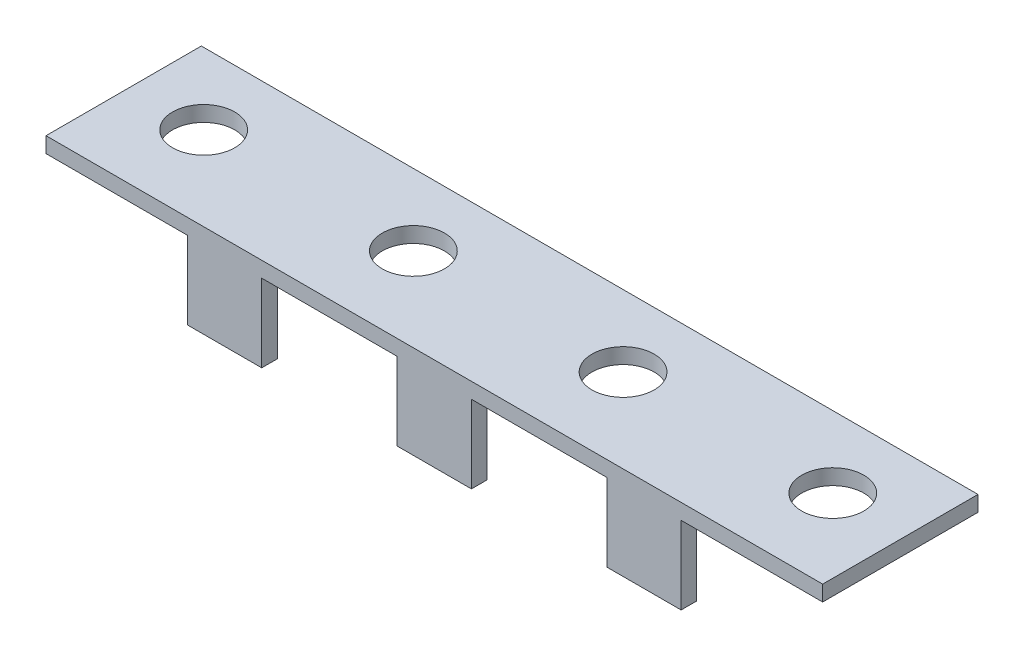
ISO-10303-21;
HEADER;
FILE_DESCRIPTION(('STEP AP214'),'2;1');
FILE_NAME('part.step','',(''),(''),'','','');
FILE_SCHEMA(('AUTOMOTIVE_DESIGN { 1 0 10303 214 1 1 1 1 }'));
ENDSEC;
DATA;
#1=APPLICATION_CONTEXT('core data for automotive mechanical design processes');
#2=APPLICATION_PROTOCOL_DEFINITION('international standard','automotive_design',2000,#1);
#3=PRODUCT_CONTEXT('',#1,'mechanical');
#4=PRODUCT('Part','Part','',(#3));
#5=PRODUCT_RELATED_PRODUCT_CATEGORY('part','',(#4));
#6=PRODUCT_DEFINITION_FORMATION('','',#4);
#7=PRODUCT_DEFINITION_CONTEXT('part definition',#1,'design');
#8=PRODUCT_DEFINITION('design','',#6,#7);
#9=PRODUCT_DEFINITION_SHAPE('','',#8);
#10=(LENGTH_UNIT() NAMED_UNIT(*) SI_UNIT(.MILLI.,.METRE.));
#11=(NAMED_UNIT(*) PLANE_ANGLE_UNIT() SI_UNIT($,.RADIAN.));
#12=(NAMED_UNIT(*) SI_UNIT($,.STERADIAN.) SOLID_ANGLE_UNIT());
#13=UNCERTAINTY_MEASURE_WITH_UNIT(LENGTH_MEASURE(1.E-05),#10,'distance_accuracy_value','');
#14=(GEOMETRIC_REPRESENTATION_CONTEXT(3) GLOBAL_UNCERTAINTY_ASSIGNED_CONTEXT((#13)) GLOBAL_UNIT_ASSIGNED_CONTEXT((#10,
#11,#12)) REPRESENTATION_CONTEXT('',''));
#15=CARTESIAN_POINT('',(0.,0.,0.));
#16=DIRECTION('',(0.,0.,1.));
#17=DIRECTION('',(1.,0.,0.));
#18=AXIS2_PLACEMENT_3D('',#15,#16,#17);
#19=CARTESIAN_POINT('',(0.,-12.7,-2.54));
#20=DIRECTION('',(0.,0.,1.));
#21=DIRECTION('',(1.,0.,0.));
#22=AXIS2_PLACEMENT_3D('',#19,#20,#21);
#23=PLANE('',#22);
#24=DIRECTION('',(1.,0.,0.));
#25=VECTOR('',#24,1.);
#26=CARTESIAN_POINT('',(0.,0.,-2.54));
#27=LINE('',#26,#25);
#28=CARTESIAN_POINT('',(91.725,0.,-2.54));
#29=VERTEX_POINT('',#28);
#30=CARTESIAN_POINT('',(103.855,0.,-2.54));
#31=VERTEX_POINT('',#30);
#32=EDGE_CURVE('E167',#29,#31,#27,.T.);
#33=ORIENTED_EDGE('',*,*,#32,.T.);
#34=DIRECTION('',(0.,1.,0.));
#35=VECTOR('',#34,1.);
#36=CARTESIAN_POINT('',(103.855,0.,-2.54));
#37=LINE('',#36,#35);
#38=CARTESIAN_POINT('',(103.855,-12.7,-2.54));
#39=VERTEX_POINT('',#38);
#40=EDGE_CURVE('E152',#39,#31,#37,.T.);
#41=ORIENTED_EDGE('',*,*,#40,.F.);
#42=DIRECTION('',(1.,0.,0.));
#43=VECTOR('',#42,1.);
#44=CARTESIAN_POINT('',(0.,-12.7,-2.54));
#45=LINE('',#44,#43);
#46=CARTESIAN_POINT('',(91.725,-12.7,-2.54));
#47=VERTEX_POINT('',#46);
#48=EDGE_CURVE('E165',#47,#39,#45,.T.);
#49=ORIENTED_EDGE('',*,*,#48,.F.);
#50=DIRECTION('',(0.,-1.,0.));
#51=VECTOR('',#50,1.);
#52=CARTESIAN_POINT('',(91.725,0.,-2.54));
#53=LINE('',#52,#51);
#54=EDGE_CURVE('E260',#29,#47,#53,.T.);
#55=ORIENTED_EDGE('',*,*,#54,.F.);
#56=EDGE_LOOP('',(#33,#41,#49,#55));
#57=FACE_BOUND('',#56,.T.);
#58=ADVANCED_FACE('F33',(#57),#23,.F.);
#59=CARTESIAN_POINT('',(57.435,0.,-2.54));
#60=VERTEX_POINT('',#59);
#61=CARTESIAN_POINT('',(69.565,0.,-2.54));
#62=VERTEX_POINT('',#61);
#63=EDGE_CURVE('E179',#60,#62,#27,.T.);
#64=ORIENTED_EDGE('',*,*,#63,.T.);
#65=DIRECTION('',(0.,1.,0.));
#66=VECTOR('',#65,1.);
#67=CARTESIAN_POINT('',(69.565,0.,-2.54));
#68=LINE('',#67,#66);
#69=CARTESIAN_POINT('',(69.565,-12.7,-2.54));
#70=VERTEX_POINT('',#69);
#71=EDGE_CURVE('E262',#70,#62,#68,.T.);
#72=ORIENTED_EDGE('',*,*,#71,.F.);
#73=CARTESIAN_POINT('',(57.435,-12.7,-2.54));
#74=VERTEX_POINT('',#73);
#75=EDGE_CURVE('E173',#74,#70,#45,.T.);
#76=ORIENTED_EDGE('',*,*,#75,.F.);
#77=DIRECTION('',(0.,-1.,0.));
#78=VECTOR('',#77,1.);
#79=CARTESIAN_POINT('',(57.435,0.,-2.54));
#80=LINE('',#79,#78);
#81=EDGE_CURVE('E277',#60,#74,#80,.T.);
#82=ORIENTED_EDGE('',*,*,#81,.F.);
#83=EDGE_LOOP('',(#64,#72,#76,#82));
#84=FACE_BOUND('',#83,.T.);
#85=ADVANCED_FACE('F327',(#84),#23,.F.);
#86=CARTESIAN_POINT('',(0.,-12.7,0.));
#87=DIRECTION('',(0.,-1.,0.));
#88=DIRECTION('',(0.,0.,-1.));
#89=AXIS2_PLACEMENT_3D('',#86,#87,#88);
#90=PLANE('',#89);
#91=DIRECTION('',(0.,0.,-1.));
#92=VECTOR('',#91,1.);
#93=CARTESIAN_POINT('',(103.855,-12.7,26.4003981977545));
#94=LINE('',#93,#92);
#95=CARTESIAN_POINT('',(103.855,-12.7,0.));
#96=VERTEX_POINT('',#95);
#97=EDGE_CURVE('E148',#96,#39,#94,.T.);
#98=ORIENTED_EDGE('',*,*,#97,.F.);
#99=DIRECTION('',(-1.,0.,0.));
#100=VECTOR('',#99,1.);
#101=CARTESIAN_POINT('',(0.,-12.7,0.));
#102=LINE('',#101,#100);
#103=CARTESIAN_POINT('',(91.725,-12.7,0.));
#104=VERTEX_POINT('',#103);
#105=EDGE_CURVE('E190',#96,#104,#102,.T.);
#106=ORIENTED_EDGE('',*,*,#105,.T.);
#107=DIRECTION('',(0.,0.,-1.));
#108=VECTOR('',#107,1.);
#109=CARTESIAN_POINT('',(91.725,-12.7,26.4003981977545));
#110=LINE('',#109,#108);
#111=EDGE_CURVE('E172',#104,#47,#110,.T.);
#112=ORIENTED_EDGE('',*,*,#111,.T.);
#113=ORIENTED_EDGE('',*,*,#48,.T.);
#114=EDGE_LOOP('',(#98,#106,#112,#113));
#115=FACE_BOUND('',#114,.T.);
#116=ADVANCED_FACE('F171',(#115),#90,.T.);
#117=DIRECTION('',(0.,0.,-1.));
#118=VECTOR('',#117,1.);
#119=CARTESIAN_POINT('',(69.565,-12.7,26.4003981977545));
#120=LINE('',#119,#118);
#121=CARTESIAN_POINT('',(69.565,-12.7,0.));
#122=VERTEX_POINT('',#121);
#123=EDGE_CURVE('E269',#122,#70,#120,.T.);
#124=ORIENTED_EDGE('',*,*,#123,.F.);
#125=CARTESIAN_POINT('',(57.435,-12.7,0.));
#126=VERTEX_POINT('',#125);
#127=EDGE_CURVE('E189',#122,#126,#102,.T.);
#128=ORIENTED_EDGE('',*,*,#127,.T.);
#129=DIRECTION('',(0.,0.,-1.));
#130=VECTOR('',#129,1.);
#131=CARTESIAN_POINT('',(57.435,-12.7,26.4003981977545));
#132=LINE('',#131,#130);
#133=EDGE_CURVE('E283',#126,#74,#132,.T.);
#134=ORIENTED_EDGE('',*,*,#133,.T.);
#135=ORIENTED_EDGE('',*,*,#75,.T.);
#136=EDGE_LOOP('',(#124,#128,#134,#135));
#137=FACE_BOUND('',#136,.T.);
#138=ADVANCED_FACE('F321',(#137),#90,.T.);
#139=CARTESIAN_POINT('',(0.,2.54,0.));
#140=DIRECTION('',(0.,-1.,0.));
#141=DIRECTION('',(0.,0.,-1.));
#142=AXIS2_PLACEMENT_3D('',#139,#140,#141);
#143=PLANE('',#142);
#144=DIRECTION('',(0.,0.,1.));
#145=VECTOR('',#144,1.);
#146=CARTESIAN_POINT('',(0.,2.54,0.));
#147=LINE('',#146,#145);
#148=CARTESIAN_POINT('',(0.,2.54,-25.4));
#149=VERTEX_POINT('',#148);
#150=CARTESIAN_POINT('',(0.,2.54,0.));
#151=VERTEX_POINT('',#150);
#152=EDGE_CURVE('E221',#149,#151,#147,.T.);
#153=ORIENTED_EDGE('',*,*,#152,.T.);
#154=DIRECTION('',(1.,0.,0.));
#155=VECTOR('',#154,1.);
#156=CARTESIAN_POINT('',(0.,2.54,0.));
#157=LINE('',#156,#155);
#158=CARTESIAN_POINT('',(127.,2.54,0.));
#159=VERTEX_POINT('',#158);
#160=EDGE_CURVE('E224',#151,#159,#157,.T.);
#161=ORIENTED_EDGE('',*,*,#160,.T.);
#162=DIRECTION('',(0.,0.,-1.));
#163=VECTOR('',#162,1.);
#164=CARTESIAN_POINT('',(127.,2.54,0.));
#165=LINE('',#164,#163);
#166=CARTESIAN_POINT('',(127.,2.54,-25.4));
#167=VERTEX_POINT('',#166);
#168=EDGE_CURVE('E227',#159,#167,#165,.T.);
#169=ORIENTED_EDGE('',*,*,#168,.T.);
#170=DIRECTION('',(-1.,0.,0.));
#171=VECTOR('',#170,1.);
#172=CARTESIAN_POINT('',(0.,2.54,-25.4));
#173=LINE('',#172,#171);
#174=EDGE_CURVE('E229',#167,#149,#173,.T.);
#175=ORIENTED_EDGE('',*,*,#174,.T.);
#176=EDGE_LOOP('',(#153,#161,#169,#175));
#177=FACE_BOUND('',#176,.T.);
#178=CARTESIAN_POINT('',(12.065,2.54,-13.716));
#179=DIRECTION('',(0.,1.,0.));
#180=DIRECTION('',(0.,0.,1.));
#181=AXIS2_PLACEMENT_3D('',#178,#179,#180);
#182=CIRCLE('',#181,5.08);
#183=CARTESIAN_POINT('',(12.065,2.54,-8.636));
#184=VERTEX_POINT('',#183);
#185=EDGE_CURVE('E215',#184,#184,#182,.T.);
#186=ORIENTED_EDGE('',*,*,#185,.F.);
#187=EDGE_LOOP('',(#186));
#188=FACE_BOUND('',#187,.T.);
#189=CARTESIAN_POINT('',(46.355,2.54,-13.716));
#190=DIRECTION('',(0.,1.,0.));
#191=DIRECTION('',(0.,0.,1.));
#192=AXIS2_PLACEMENT_3D('',#189,#190,#191);
#193=CIRCLE('',#192,5.08000000000001);
#194=CARTESIAN_POINT('',(46.355,2.54,-8.63599999999999));
#195=VERTEX_POINT('',#194);
#196=EDGE_CURVE('E209',#195,#195,#193,.T.);
#197=ORIENTED_EDGE('',*,*,#196,.F.);
#198=EDGE_LOOP('',(#197));
#199=FACE_BOUND('',#198,.T.);
#200=CARTESIAN_POINT('',(80.645,2.54,-13.716));
#201=DIRECTION('',(0.,1.,0.));
#202=DIRECTION('',(0.,0.,1.));
#203=AXIS2_PLACEMENT_3D('',#200,#201,#202);
#204=CIRCLE('',#203,5.08);
#205=CARTESIAN_POINT('',(80.645,2.54,-8.636));
#206=VERTEX_POINT('',#205);
#207=EDGE_CURVE('E203',#206,#206,#204,.T.);
#208=ORIENTED_EDGE('',*,*,#207,.F.);
#209=EDGE_LOOP('',(#208));
#210=FACE_BOUND('',#209,.T.);
#211=CARTESIAN_POINT('',(114.935,2.54,-13.716));
#212=DIRECTION('',(0.,1.,0.));
#213=DIRECTION('',(0.,0.,1.));
#214=AXIS2_PLACEMENT_3D('',#211,#212,#213);
#215=CIRCLE('',#214,5.08);
#216=CARTESIAN_POINT('',(114.935,2.54,-8.636));
#217=VERTEX_POINT('',#216);
#218=EDGE_CURVE('E195',#217,#217,#215,.T.);
#219=ORIENTED_EDGE('',*,*,#218,.F.);
#220=EDGE_LOOP('',(#219));
#221=FACE_BOUND('',#220,.T.);
#222=ADVANCED_FACE('F374',(#177,#188,#199,#210,#221),#143,.F.);
#223=CARTESIAN_POINT('',(0.,0.,0.));
#224=DIRECTION('',(0.,-1.,0.));
#225=DIRECTION('',(0.,0.,-1.));
#226=AXIS2_PLACEMENT_3D('',#223,#224,#225);
#227=PLANE('',#226);
#228=CARTESIAN_POINT('',(23.145,0.,-2.54));
#229=VERTEX_POINT('',#228);
#230=CARTESIAN_POINT('',(35.275,0.,-2.54));
#231=VERTEX_POINT('',#230);
#232=EDGE_CURVE('E174',#229,#231,#27,.T.);
#233=ORIENTED_EDGE('',*,*,#232,.F.);
#234=DIRECTION('',(0.,0.,-1.));
#235=VECTOR('',#234,1.);
#236=CARTESIAN_POINT('',(23.145,0.,26.4003981977545));
#237=LINE('',#236,#235);
#238=CARTESIAN_POINT('',(23.145,0.,0.));
#239=VERTEX_POINT('',#238);
#240=EDGE_CURVE('E294',#239,#229,#237,.T.);
#241=ORIENTED_EDGE('',*,*,#240,.F.);
#242=DIRECTION('',(-1.,0.,0.));
#243=VECTOR('',#242,1.);
#244=CARTESIAN_POINT('',(23.145,0.,0.));
#245=LINE('',#244,#243);
#246=CARTESIAN_POINT('',(0.,0.,0.));
#247=VERTEX_POINT('',#246);
#248=EDGE_CURVE('E291',#239,#247,#245,.T.);
#249=ORIENTED_EDGE('',*,*,#248,.T.);
#250=DIRECTION('',(0.,0.,1.));
#251=VECTOR('',#250,1.);
#252=CARTESIAN_POINT('',(0.,0.,0.));
#253=LINE('',#252,#251);
#254=CARTESIAN_POINT('',(0.,0.,-25.4));
#255=VERTEX_POINT('',#254);
#256=EDGE_CURVE('E218',#255,#247,#253,.T.);
#257=ORIENTED_EDGE('',*,*,#256,.F.);
#258=DIRECTION('',(-1.,0.,0.));
#259=VECTOR('',#258,1.);
#260=CARTESIAN_POINT('',(0.,0.,-25.4));
#261=LINE('',#260,#259);
#262=CARTESIAN_POINT('',(127.,0.,-25.4));
#263=VERTEX_POINT('',#262);
#264=EDGE_CURVE('E225',#263,#255,#261,.T.);
#265=ORIENTED_EDGE('',*,*,#264,.F.);
#266=DIRECTION('',(0.,0.,-1.));
#267=VECTOR('',#266,1.);
#268=CARTESIAN_POINT('',(127.,0.,0.));
#269=LINE('',#268,#267);
#270=CARTESIAN_POINT('',(127.,0.,0.));
#271=VERTEX_POINT('',#270);
#272=EDGE_CURVE('E233',#271,#263,#269,.T.);
#273=ORIENTED_EDGE('',*,*,#272,.F.);
#274=DIRECTION('',(-1.,0.,0.));
#275=VECTOR('',#274,1.);
#276=CARTESIAN_POINT('',(127.,0.,0.));
#277=LINE('',#276,#275);
#278=CARTESIAN_POINT('',(103.855,0.,0.));
#279=VERTEX_POINT('',#278);
#280=EDGE_CURVE('E249',#271,#279,#277,.T.);
#281=ORIENTED_EDGE('',*,*,#280,.T.);
#282=DIRECTION('',(0.,0.,-1.));
#283=VECTOR('',#282,1.);
#284=CARTESIAN_POINT('',(103.855,0.,26.4003981977545));
#285=LINE('',#284,#283);
#286=EDGE_CURVE('E160',#279,#31,#285,.T.);
#287=ORIENTED_EDGE('',*,*,#286,.T.);
#288=ORIENTED_EDGE('',*,*,#32,.F.);
#289=DIRECTION('',(0.,0.,-1.));
#290=VECTOR('',#289,1.);
#291=CARTESIAN_POINT('',(91.725,0.,26.4003981977545));
#292=LINE('',#291,#290);
#293=CARTESIAN_POINT('',(91.725,0.,0.));
#294=VERTEX_POINT('',#293);
#295=EDGE_CURVE('E257',#294,#29,#292,.T.);
#296=ORIENTED_EDGE('',*,*,#295,.F.);
#297=DIRECTION('',(-1.,0.,0.));
#298=VECTOR('',#297,1.);
#299=CARTESIAN_POINT('',(91.725,0.,0.));
#300=LINE('',#299,#298);
#301=CARTESIAN_POINT('',(69.565,0.,0.));
#302=VERTEX_POINT('',#301);
#303=EDGE_CURVE('E256',#294,#302,#300,.T.);
#304=ORIENTED_EDGE('',*,*,#303,.T.);
#305=DIRECTION('',(0.,0.,-1.));
#306=VECTOR('',#305,1.);
#307=CARTESIAN_POINT('',(69.565,0.,26.4003981977545));
#308=LINE('',#307,#306);
#309=EDGE_CURVE('E267',#302,#62,#308,.T.);
#310=ORIENTED_EDGE('',*,*,#309,.T.);
#311=ORIENTED_EDGE('',*,*,#63,.F.);
#312=DIRECTION('',(0.,0.,-1.));
#313=VECTOR('',#312,1.);
#314=CARTESIAN_POINT('',(57.435,0.,26.4003981977545));
#315=LINE('',#314,#313);
#316=CARTESIAN_POINT('',(57.435,0.,0.));
#317=VERTEX_POINT('',#316);
#318=EDGE_CURVE('E274',#317,#60,#315,.T.);
#319=ORIENTED_EDGE('',*,*,#318,.F.);
#320=DIRECTION('',(-1.,0.,0.));
#321=VECTOR('',#320,1.);
#322=CARTESIAN_POINT('',(57.435,0.,0.));
#323=LINE('',#322,#321);
#324=CARTESIAN_POINT('',(35.275,0.,0.));
#325=VERTEX_POINT('',#324);
#326=EDGE_CURVE('E273',#317,#325,#323,.T.);
#327=ORIENTED_EDGE('',*,*,#326,.T.);
#328=DIRECTION('',(0.,0.,-1.));
#329=VECTOR('',#328,1.);
#330=CARTESIAN_POINT('',(35.275,0.,26.4003981977545));
#331=LINE('',#330,#329);
#332=EDGE_CURVE('E285',#325,#231,#331,.T.);
#333=ORIENTED_EDGE('',*,*,#332,.T.);
#334=EDGE_LOOP('',(#233,#241,#249,#257,#265,#273,#281,#287,#288,#296,#304,#310,#311,#319,#327,#333));
#335=FACE_BOUND('',#334,.T.);
#336=CARTESIAN_POINT('',(80.645,0.,-13.716));
#337=DIRECTION('',(0.,1.,0.));
#338=DIRECTION('',(0.,0.,1.));
#339=AXIS2_PLACEMENT_3D('',#336,#337,#338);
#340=CIRCLE('',#339,5.08);
#341=CARTESIAN_POINT('',(80.645,0.,-8.636));
#342=VERTEX_POINT('',#341);
#343=EDGE_CURVE('E200',#342,#342,#340,.T.);
#344=ORIENTED_EDGE('',*,*,#343,.T.);
#345=EDGE_LOOP('',(#344));
#346=FACE_BOUND('',#345,.T.);
#347=CARTESIAN_POINT('',(12.065,0.,-13.716));
#348=DIRECTION('',(0.,1.,0.));
#349=DIRECTION('',(0.,0.,1.));
#350=AXIS2_PLACEMENT_3D('',#347,#348,#349);
#351=CIRCLE('',#350,5.08);
#352=CARTESIAN_POINT('',(12.065,0.,-8.636));
#353=VERTEX_POINT('',#352);
#354=EDGE_CURVE('E212',#353,#353,#351,.T.);
#355=ORIENTED_EDGE('',*,*,#354,.T.);
#356=EDGE_LOOP('',(#355));
#357=FACE_BOUND('',#356,.T.);
#358=CARTESIAN_POINT('',(46.355,0.,-13.716));
#359=DIRECTION('',(0.,1.,0.));
#360=DIRECTION('',(0.,0.,1.));
#361=AXIS2_PLACEMENT_3D('',#358,#359,#360);
#362=CIRCLE('',#361,5.08000000000001);
#363=CARTESIAN_POINT('',(46.355,0.,-8.63599999999999));
#364=VERTEX_POINT('',#363);
#365=EDGE_CURVE('E206',#364,#364,#362,.T.);
#366=ORIENTED_EDGE('',*,*,#365,.T.);
#367=EDGE_LOOP('',(#366));
#368=FACE_BOUND('',#367,.T.);
#369=CARTESIAN_POINT('',(114.935,0.,-13.716));
#370=DIRECTION('',(0.,1.,0.));
#371=DIRECTION('',(0.,0.,1.));
#372=AXIS2_PLACEMENT_3D('',#369,#370,#371);
#373=CIRCLE('',#372,5.08);
#374=CARTESIAN_POINT('',(114.935,0.,-8.636));
#375=VERTEX_POINT('',#374);
#376=EDGE_CURVE('E193',#375,#375,#373,.T.);
#377=ORIENTED_EDGE('',*,*,#376,.T.);
#378=EDGE_LOOP('',(#377));
#379=FACE_BOUND('',#378,.T.);
#380=ADVANCED_FACE('F312',(#335,#346,#357,#368,#379),#227,.T.);
#381=CARTESIAN_POINT('',(0.,2.54,0.));
#382=DIRECTION('',(1.,0.,0.));
#383=DIRECTION('',(0.,0.,-1.));
#384=AXIS2_PLACEMENT_3D('',#381,#382,#383);
#385=PLANE('',#384);
#386=ORIENTED_EDGE('',*,*,#256,.T.);
#387=DIRECTION('',(0.,-1.,0.));
#388=VECTOR('',#387,1.);
#389=CARTESIAN_POINT('',(0.,2.54,0.));
#390=LINE('',#389,#388);
#391=EDGE_CURVE('E11',#151,#247,#390,.T.);
#392=ORIENTED_EDGE('',*,*,#391,.F.);
#393=ORIENTED_EDGE('',*,*,#152,.F.);
#394=DIRECTION('',(0.,-1.,0.));
#395=VECTOR('',#394,1.);
#396=CARTESIAN_POINT('',(0.,2.54,-25.4));
#397=LINE('',#396,#395);
#398=EDGE_CURVE('E231',#149,#255,#397,.T.);
#399=ORIENTED_EDGE('',*,*,#398,.T.);
#400=EDGE_LOOP('',(#386,#392,#393,#399));
#401=FACE_BOUND('',#400,.T.);
#402=ADVANCED_FACE('F35',(#401),#385,.F.);
#403=CARTESIAN_POINT('',(0.,2.54,0.));
#404=DIRECTION('',(0.,0.,-1.));
#405=DIRECTION('',(-1.,0.,0.));
#406=AXIS2_PLACEMENT_3D('',#403,#404,#405);
#407=PLANE('',#406);
#408=DIRECTION('',(0.,-1.,0.));
#409=VECTOR('',#408,1.);
#410=CARTESIAN_POINT('',(103.855,0.,0.));
#411=LINE('',#410,#409);
#412=EDGE_CURVE('E155',#279,#96,#411,.T.);
#413=ORIENTED_EDGE('',*,*,#412,.F.);
#414=ORIENTED_EDGE('',*,*,#280,.F.);
#415=DIRECTION('',(0.,-1.,0.));
#416=VECTOR('',#415,1.);
#417=CARTESIAN_POINT('',(127.,2.54,0.));
#418=LINE('',#417,#416);
#419=EDGE_CURVE('E41',#159,#271,#418,.T.);
#420=ORIENTED_EDGE('',*,*,#419,.F.);
#421=ORIENTED_EDGE('',*,*,#160,.F.);
#422=ORIENTED_EDGE('',*,*,#391,.T.);
#423=ORIENTED_EDGE('',*,*,#248,.F.);
#424=DIRECTION('',(0.,1.,0.));
#425=VECTOR('',#424,1.);
#426=CARTESIAN_POINT('',(23.145,0.,0.));
#427=LINE('',#426,#425);
#428=CARTESIAN_POINT('',(23.145,-12.7,0.));
#429=VERTEX_POINT('',#428);
#430=EDGE_CURVE('E280',#429,#239,#427,.T.);
#431=ORIENTED_EDGE('',*,*,#430,.F.);
#432=CARTESIAN_POINT('',(35.275,-12.7,0.));
#433=VERTEX_POINT('',#432);
#434=EDGE_CURVE('E184',#433,#429,#102,.T.);
#435=ORIENTED_EDGE('',*,*,#434,.F.);
#436=DIRECTION('',(0.,-1.,0.));
#437=VECTOR('',#436,1.);
#438=CARTESIAN_POINT('',(35.275,0.,0.));
#439=LINE('',#438,#437);
#440=EDGE_CURVE('E48',#325,#433,#439,.T.);
#441=ORIENTED_EDGE('',*,*,#440,.F.);
#442=ORIENTED_EDGE('',*,*,#326,.F.);
#443=DIRECTION('',(0.,1.,0.));
#444=VECTOR('',#443,1.);
#445=CARTESIAN_POINT('',(57.435,0.,0.));
#446=LINE('',#445,#444);
#447=EDGE_CURVE('E263',#126,#317,#446,.T.);
#448=ORIENTED_EDGE('',*,*,#447,.F.);
#449=ORIENTED_EDGE('',*,*,#127,.F.);
#450=DIRECTION('',(0.,-1.,0.));
#451=VECTOR('',#450,1.);
#452=CARTESIAN_POINT('',(69.565,0.,0.));
#453=LINE('',#452,#451);
#454=EDGE_CURVE('E56',#302,#122,#453,.T.);
#455=ORIENTED_EDGE('',*,*,#454,.F.);
#456=ORIENTED_EDGE('',*,*,#303,.F.);
#457=DIRECTION('',(0.,1.,0.));
#458=VECTOR('',#457,1.);
#459=CARTESIAN_POINT('',(91.725,0.,0.));
#460=LINE('',#459,#458);
#461=EDGE_CURVE('E168',#104,#294,#460,.T.);
#462=ORIENTED_EDGE('',*,*,#461,.F.);
#463=ORIENTED_EDGE('',*,*,#105,.F.);
#464=EDGE_LOOP('',(#413,#414,#420,#421,#422,#423,#431,#435,#441,#442,#448,#449,#455,#456,#462,#463));
#465=FACE_BOUND('',#464,.T.);
#466=ADVANCED_FACE('F248',(#465),#407,.F.);
#467=CARTESIAN_POINT('',(127.,2.54,0.));
#468=DIRECTION('',(-1.,0.,0.));
#469=DIRECTION('',(0.,0.,1.));
#470=AXIS2_PLACEMENT_3D('',#467,#468,#469);
#471=PLANE('',#470);
#472=ORIENTED_EDGE('',*,*,#419,.T.);
#473=ORIENTED_EDGE('',*,*,#272,.T.);
#474=DIRECTION('',(0.,-1.,0.));
#475=VECTOR('',#474,1.);
#476=CARTESIAN_POINT('',(127.,2.54,-25.4));
#477=LINE('',#476,#475);
#478=EDGE_CURVE('E238',#167,#263,#477,.T.);
#479=ORIENTED_EDGE('',*,*,#478,.F.);
#480=ORIENTED_EDGE('',*,*,#168,.F.);
#481=EDGE_LOOP('',(#472,#473,#479,#480));
#482=FACE_BOUND('',#481,.T.);
#483=ADVANCED_FACE('F244',(#482),#471,.F.);
#484=CARTESIAN_POINT('',(0.,2.54,-25.4));
#485=DIRECTION('',(0.,0.,1.));
#486=DIRECTION('',(1.,0.,0.));
#487=AXIS2_PLACEMENT_3D('',#484,#485,#486);
#488=PLANE('',#487);
#489=ORIENTED_EDGE('',*,*,#264,.T.);
#490=ORIENTED_EDGE('',*,*,#398,.F.);
#491=ORIENTED_EDGE('',*,*,#174,.F.);
#492=ORIENTED_EDGE('',*,*,#478,.T.);
#493=EDGE_LOOP('',(#489,#490,#491,#492));
#494=FACE_BOUND('',#493,.T.);
#495=ADVANCED_FACE('F372',(#494),#488,.F.);
#496=CARTESIAN_POINT('',(12.065,2.54,-13.716));
#497=DIRECTION('',(0.,-1.,0.));
#498=DIRECTION('',(0.,0.,-1.));
#499=AXIS2_PLACEMENT_3D('',#496,#497,#498);
#500=CYLINDRICAL_SURFACE('',#499,5.08);
#501=ORIENTED_EDGE('',*,*,#185,.T.);
#502=EDGE_LOOP('',(#501));
#503=FACE_BOUND('',#502,.T.);
#504=ORIENTED_EDGE('',*,*,#354,.F.);
#505=EDGE_LOOP('',(#504));
#506=FACE_BOUND('',#505,.T.);
#507=ADVANCED_FACE('F368',(#503,#506),#500,.F.);
#508=CARTESIAN_POINT('',(46.355,2.54,-13.716));
#509=DIRECTION('',(0.,-1.,0.));
#510=DIRECTION('',(0.,0.,-1.));
#511=AXIS2_PLACEMENT_3D('',#508,#509,#510);
#512=CYLINDRICAL_SURFACE('',#511,5.08000000000001);
#513=ORIENTED_EDGE('',*,*,#196,.T.);
#514=EDGE_LOOP('',(#513));
#515=FACE_BOUND('',#514,.T.);
#516=ORIENTED_EDGE('',*,*,#365,.F.);
#517=EDGE_LOOP('',(#516));
#518=FACE_BOUND('',#517,.T.);
#519=ADVANCED_FACE('F361',(#515,#518),#512,.F.);
#520=CARTESIAN_POINT('',(80.645,2.54,-13.716));
#521=DIRECTION('',(0.,-1.,0.));
#522=DIRECTION('',(0.,0.,-1.));
#523=AXIS2_PLACEMENT_3D('',#520,#521,#522);
#524=CYLINDRICAL_SURFACE('',#523,5.08);
#525=ORIENTED_EDGE('',*,*,#207,.T.);
#526=EDGE_LOOP('',(#525));
#527=FACE_BOUND('',#526,.T.);
#528=ORIENTED_EDGE('',*,*,#343,.F.);
#529=EDGE_LOOP('',(#528));
#530=FACE_BOUND('',#529,.T.);
#531=ADVANCED_FACE('F356',(#527,#530),#524,.F.);
#532=CARTESIAN_POINT('',(114.935,2.54,-13.716));
#533=DIRECTION('',(0.,-1.,0.));
#534=DIRECTION('',(0.,0.,-1.));
#535=AXIS2_PLACEMENT_3D('',#532,#533,#534);
#536=CYLINDRICAL_SURFACE('',#535,5.08);
#537=ORIENTED_EDGE('',*,*,#218,.T.);
#538=EDGE_LOOP('',(#537));
#539=FACE_BOUND('',#538,.T.);
#540=ORIENTED_EDGE('',*,*,#376,.F.);
#541=EDGE_LOOP('',(#540));
#542=FACE_BOUND('',#541,.T.);
#543=ADVANCED_FACE('F351',(#539,#542),#536,.F.);
#544=ORIENTED_EDGE('',*,*,#232,.T.);
#545=DIRECTION('',(0.,1.,0.));
#546=VECTOR('',#545,1.);
#547=CARTESIAN_POINT('',(35.275,0.,-2.54));
#548=LINE('',#547,#546);
#549=CARTESIAN_POINT('',(35.275,-12.7,-2.54));
#550=VERTEX_POINT('',#549);
#551=EDGE_CURVE('E279',#550,#231,#548,.T.);
#552=ORIENTED_EDGE('',*,*,#551,.F.);
#553=CARTESIAN_POINT('',(23.145,-12.7,-2.54));
#554=VERTEX_POINT('',#553);
#555=EDGE_CURVE('E176',#554,#550,#45,.T.);
#556=ORIENTED_EDGE('',*,*,#555,.F.);
#557=DIRECTION('',(0.,-1.,0.));
#558=VECTOR('',#557,1.);
#559=CARTESIAN_POINT('',(23.145,0.,-2.54));
#560=LINE('',#559,#558);
#561=EDGE_CURVE('E296',#229,#554,#560,.T.);
#562=ORIENTED_EDGE('',*,*,#561,.F.);
#563=EDGE_LOOP('',(#544,#552,#556,#562));
#564=FACE_BOUND('',#563,.T.);
#565=ADVANCED_FACE('F305',(#564),#23,.F.);
#566=DIRECTION('',(0.,0.,-1.));
#567=VECTOR('',#566,1.);
#568=CARTESIAN_POINT('',(35.275,-12.7,26.4003981977545));
#569=LINE('',#568,#567);
#570=EDGE_CURVE('E287',#433,#550,#569,.T.);
#571=ORIENTED_EDGE('',*,*,#570,.F.);
#572=ORIENTED_EDGE('',*,*,#434,.T.);
#573=DIRECTION('',(0.,0.,-1.));
#574=VECTOR('',#573,1.);
#575=CARTESIAN_POINT('',(23.145,-12.7,26.4003981977545));
#576=LINE('',#575,#574);
#577=EDGE_CURVE('E298',#429,#554,#576,.T.);
#578=ORIENTED_EDGE('',*,*,#577,.T.);
#579=ORIENTED_EDGE('',*,*,#555,.T.);
#580=EDGE_LOOP('',(#571,#572,#578,#579));
#581=FACE_BOUND('',#580,.T.);
#582=ADVANCED_FACE('F299',(#581),#90,.T.);
#583=CARTESIAN_POINT('',(23.145,0.,26.4003981977545));
#584=DIRECTION('',(1.,0.,0.));
#585=DIRECTION('',(0.,0.,-1.));
#586=AXIS2_PLACEMENT_3D('',#583,#584,#585);
#587=PLANE('',#586);
#588=ORIENTED_EDGE('',*,*,#430,.T.);
#589=ORIENTED_EDGE('',*,*,#240,.T.);
#590=ORIENTED_EDGE('',*,*,#561,.T.);
#591=ORIENTED_EDGE('',*,*,#577,.F.);
#592=EDGE_LOOP('',(#588,#589,#590,#591));
#593=FACE_BOUND('',#592,.T.);
#594=ADVANCED_FACE('F311',(#593),#587,.F.);
#595=CARTESIAN_POINT('',(57.435,0.,26.4003981977545));
#596=DIRECTION('',(1.,0.,0.));
#597=DIRECTION('',(0.,0.,-1.));
#598=AXIS2_PLACEMENT_3D('',#595,#596,#597);
#599=PLANE('',#598);
#600=ORIENTED_EDGE('',*,*,#447,.T.);
#601=ORIENTED_EDGE('',*,*,#318,.T.);
#602=ORIENTED_EDGE('',*,*,#81,.T.);
#603=ORIENTED_EDGE('',*,*,#133,.F.);
#604=EDGE_LOOP('',(#600,#601,#602,#603));
#605=FACE_BOUND('',#604,.T.);
#606=ADVANCED_FACE('F341',(#605),#599,.F.);
#607=CARTESIAN_POINT('',(35.275,0.,26.4003981977545));
#608=DIRECTION('',(-1.,0.,0.));
#609=DIRECTION('',(0.,0.,1.));
#610=AXIS2_PLACEMENT_3D('',#607,#608,#609);
#611=PLANE('',#610);
#612=ORIENTED_EDGE('',*,*,#440,.T.);
#613=ORIENTED_EDGE('',*,*,#570,.T.);
#614=ORIENTED_EDGE('',*,*,#551,.T.);
#615=ORIENTED_EDGE('',*,*,#332,.F.);
#616=EDGE_LOOP('',(#612,#613,#614,#615));
#617=FACE_BOUND('',#616,.T.);
#618=ADVANCED_FACE('F307',(#617),#611,.F.);
#619=CARTESIAN_POINT('',(91.725,0.,26.4003981977545));
#620=DIRECTION('',(1.,0.,0.));
#621=DIRECTION('',(0.,0.,-1.));
#622=AXIS2_PLACEMENT_3D('',#619,#620,#621);
#623=PLANE('',#622);
#624=ORIENTED_EDGE('',*,*,#461,.T.);
#625=ORIENTED_EDGE('',*,*,#295,.T.);
#626=ORIENTED_EDGE('',*,*,#54,.T.);
#627=ORIENTED_EDGE('',*,*,#111,.F.);
#628=EDGE_LOOP('',(#624,#625,#626,#627));
#629=FACE_BOUND('',#628,.T.);
#630=ADVANCED_FACE('F333',(#629),#623,.F.);
#631=CARTESIAN_POINT('',(69.565,0.,26.4003981977545));
#632=DIRECTION('',(-1.,0.,0.));
#633=DIRECTION('',(0.,0.,1.));
#634=AXIS2_PLACEMENT_3D('',#631,#632,#633);
#635=PLANE('',#634);
#636=ORIENTED_EDGE('',*,*,#454,.T.);
#637=ORIENTED_EDGE('',*,*,#123,.T.);
#638=ORIENTED_EDGE('',*,*,#71,.T.);
#639=ORIENTED_EDGE('',*,*,#309,.F.);
#640=EDGE_LOOP('',(#636,#637,#638,#639));
#641=FACE_BOUND('',#640,.T.);
#642=ADVANCED_FACE('F324',(#641),#635,.F.);
#643=CARTESIAN_POINT('',(103.855,0.,26.4003981977545));
#644=DIRECTION('',(-1.,0.,0.));
#645=DIRECTION('',(0.,0.,1.));
#646=AXIS2_PLACEMENT_3D('',#643,#644,#645);
#647=PLANE('',#646);
#648=ORIENTED_EDGE('',*,*,#412,.T.);
#649=ORIENTED_EDGE('',*,*,#97,.T.);
#650=ORIENTED_EDGE('',*,*,#40,.T.);
#651=ORIENTED_EDGE('',*,*,#286,.F.);
#652=EDGE_LOOP('',(#648,#649,#650,#651));
#653=FACE_BOUND('',#652,.T.);
#654=ADVANCED_FACE('F150',(#653),#647,.F.);
#655=CLOSED_SHELL('',(#58,#85,#116,#138,#222,#380,#402,#466,#483,#495,#507,#519,#531,#543,#565,
#582,#594,#606,#618,#630,#642,#654));
#656=MANIFOLD_SOLID_BREP('B2',#655);
#657=ADVANCED_BREP_SHAPE_REPRESENTATION('',(#18,#656),#14);
#658=SHAPE_DEFINITION_REPRESENTATION(#9,#657);
ENDSEC;
END-ISO-10303-21;
